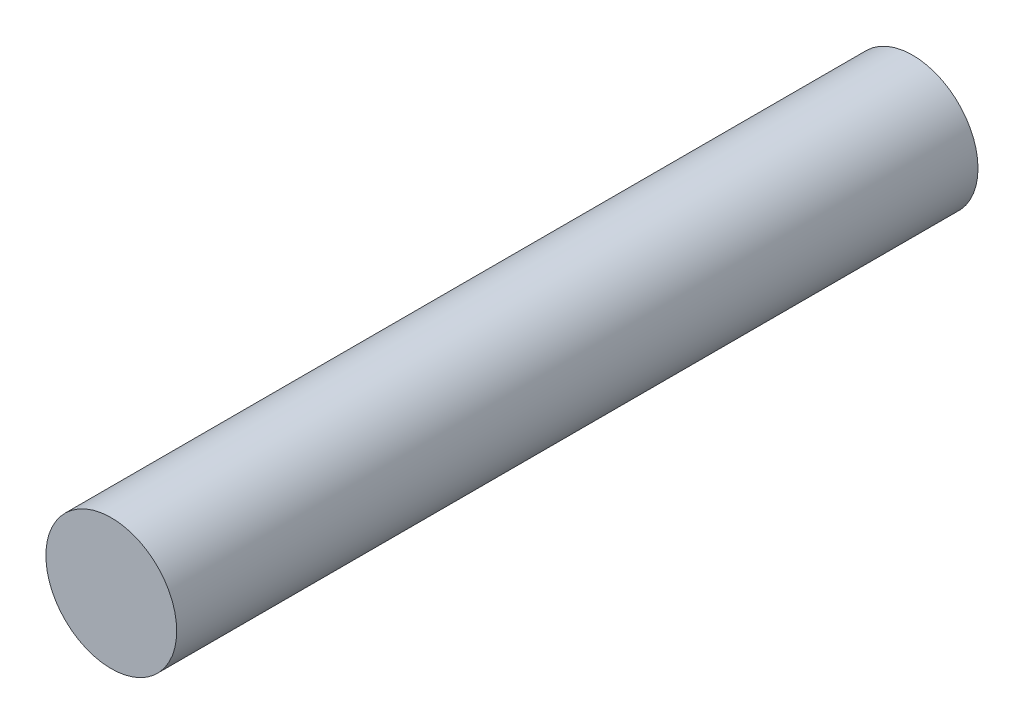
ISO-10303-21;
HEADER;
FILE_DESCRIPTION(('STEP AP214'),'2;1');
FILE_NAME('part.step','',(''),(''),'','','');
FILE_SCHEMA(('AUTOMOTIVE_DESIGN { 1 0 10303 214 1 1 1 1 }'));
ENDSEC;
DATA;
#1=APPLICATION_CONTEXT('core data for automotive mechanical design processes');
#2=APPLICATION_PROTOCOL_DEFINITION('international standard','automotive_design',2000,#1);
#3=PRODUCT_CONTEXT('',#1,'mechanical');
#4=PRODUCT('Part','Part','',(#3));
#5=PRODUCT_RELATED_PRODUCT_CATEGORY('part','',(#4));
#6=PRODUCT_DEFINITION_FORMATION('','',#4);
#7=PRODUCT_DEFINITION_CONTEXT('part definition',#1,'design');
#8=PRODUCT_DEFINITION('design','',#6,#7);
#9=PRODUCT_DEFINITION_SHAPE('','',#8);
#10=(LENGTH_UNIT() NAMED_UNIT(*) SI_UNIT(.MILLI.,.METRE.));
#11=(NAMED_UNIT(*) PLANE_ANGLE_UNIT() SI_UNIT($,.RADIAN.));
#12=(NAMED_UNIT(*) SI_UNIT($,.STERADIAN.) SOLID_ANGLE_UNIT());
#13=UNCERTAINTY_MEASURE_WITH_UNIT(LENGTH_MEASURE(1.E-05),#10,'distance_accuracy_value','');
#14=(GEOMETRIC_REPRESENTATION_CONTEXT(3) GLOBAL_UNCERTAINTY_ASSIGNED_CONTEXT((#13)) GLOBAL_UNIT_ASSIGNED_CONTEXT((#10,
#11,#12)) REPRESENTATION_CONTEXT('',''));
#15=CARTESIAN_POINT('',(0.,0.,0.));
#16=DIRECTION('',(0.,0.,1.));
#17=DIRECTION('',(1.,0.,0.));
#18=AXIS2_PLACEMENT_3D('',#15,#16,#17);
#19=CARTESIAN_POINT('',(0.,0.,49.));
#20=DIRECTION('',(0.,0.,-1.));
#21=DIRECTION('',(-1.,0.,0.));
#22=AXIS2_PLACEMENT_3D('',#19,#20,#21);
#23=CYLINDRICAL_SURFACE('',#22,4.);
#24=CARTESIAN_POINT('',(0.,0.,49.));
#25=DIRECTION('',(0.,0.,1.));
#26=DIRECTION('',(1.,0.,0.));
#27=AXIS2_PLACEMENT_3D('',#24,#25,#26);
#28=CIRCLE('',#27,4.);
#29=CARTESIAN_POINT('',(4.,0.,49.));
#30=VERTEX_POINT('',#29);
#31=EDGE_CURVE('E10',#30,#30,#28,.T.);
#32=ORIENTED_EDGE('',*,*,#31,.F.);
#33=EDGE_LOOP('',(#32));
#34=FACE_BOUND('',#33,.T.);
#35=CARTESIAN_POINT('',(0.,0.,0.));
#36=DIRECTION('',(0.,0.,1.));
#37=DIRECTION('',(1.,0.,0.));
#38=AXIS2_PLACEMENT_3D('',#35,#36,#37);
#39=CIRCLE('',#38,4.);
#40=CARTESIAN_POINT('',(4.,0.,0.));
#41=VERTEX_POINT('',#40);
#42=EDGE_CURVE('E40',#41,#41,#39,.T.);
#43=ORIENTED_EDGE('',*,*,#42,.T.);
#44=EDGE_LOOP('',(#43));
#45=FACE_BOUND('',#44,.T.);
#46=ADVANCED_FACE('F37',(#34,#45),#23,.T.);
#47=CARTESIAN_POINT('',(0.,0.,49.));
#48=DIRECTION('',(0.,0.,1.));
#49=DIRECTION('',(1.,0.,0.));
#50=AXIS2_PLACEMENT_3D('',#47,#48,#49);
#51=PLANE('',#50);
#52=ORIENTED_EDGE('',*,*,#31,.T.);
#53=EDGE_LOOP('',(#52));
#54=FACE_BOUND('',#53,.T.);
#55=ADVANCED_FACE('F54',(#54),#51,.T.);
#56=CARTESIAN_POINT('',(0.,0.,0.));
#57=DIRECTION('',(0.,0.,1.));
#58=DIRECTION('',(1.,0.,0.));
#59=AXIS2_PLACEMENT_3D('',#56,#57,#58);
#60=PLANE('',#59);
#61=ORIENTED_EDGE('',*,*,#42,.F.);
#62=EDGE_LOOP('',(#61));
#63=FACE_BOUND('',#62,.T.);
#64=ADVANCED_FACE('F52',(#63),#60,.F.);
#65=CLOSED_SHELL('',(#46,#55,#64));
#66=MANIFOLD_SOLID_BREP('B2',#65);
#67=ADVANCED_BREP_SHAPE_REPRESENTATION('',(#18,#66),#14);
#68=SHAPE_DEFINITION_REPRESENTATION(#9,#67);
ENDSEC;
END-ISO-10303-21;
